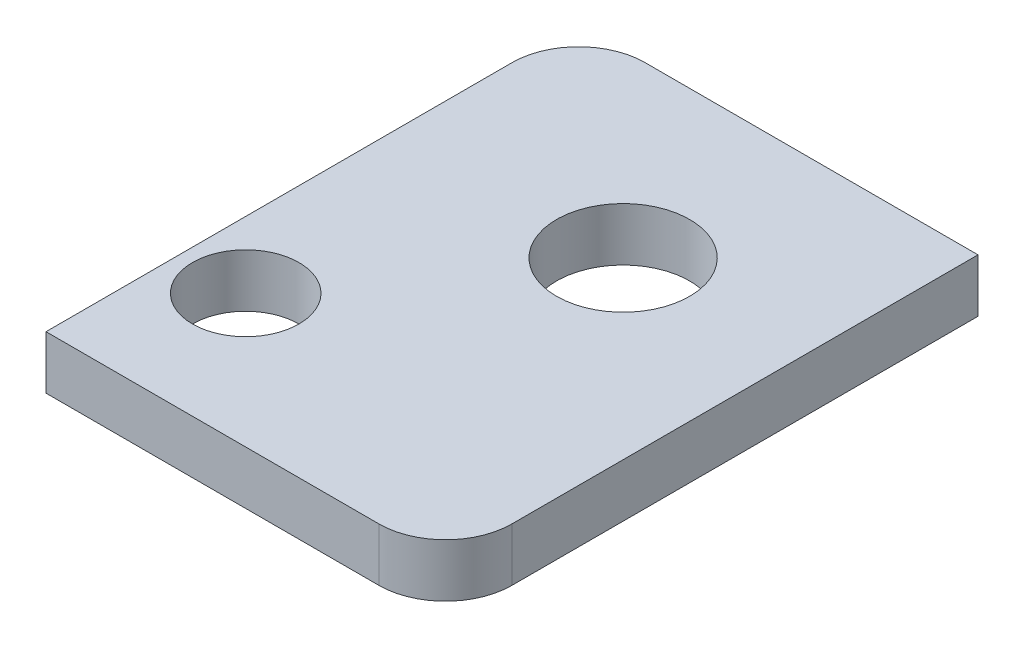
ISO-10303-21;
HEADER;
FILE_DESCRIPTION(('STEP AP214'),'2;1');
FILE_NAME('part.step','',(''),(''),'','','');
FILE_SCHEMA(('AUTOMOTIVE_DESIGN { 1 0 10303 214 1 1 1 1 }'));
ENDSEC;
DATA;
#1=APPLICATION_CONTEXT('core data for automotive mechanical design processes');
#2=APPLICATION_PROTOCOL_DEFINITION('international standard','automotive_design',2000,#1);
#3=PRODUCT_CONTEXT('',#1,'mechanical');
#4=PRODUCT('Part','Part','',(#3));
#5=PRODUCT_RELATED_PRODUCT_CATEGORY('part','',(#4));
#6=PRODUCT_DEFINITION_FORMATION('','',#4);
#7=PRODUCT_DEFINITION_CONTEXT('part definition',#1,'design');
#8=PRODUCT_DEFINITION('design','',#6,#7);
#9=PRODUCT_DEFINITION_SHAPE('','',#8);
#10=(LENGTH_UNIT() NAMED_UNIT(*) SI_UNIT(.MILLI.,.METRE.));
#11=(NAMED_UNIT(*) PLANE_ANGLE_UNIT() SI_UNIT($,.RADIAN.));
#12=(NAMED_UNIT(*) SI_UNIT($,.STERADIAN.) SOLID_ANGLE_UNIT());
#13=UNCERTAINTY_MEASURE_WITH_UNIT(LENGTH_MEASURE(1.E-05),#10,'distance_accuracy_value','');
#14=(GEOMETRIC_REPRESENTATION_CONTEXT(3) GLOBAL_UNCERTAINTY_ASSIGNED_CONTEXT((#13)) GLOBAL_UNIT_ASSIGNED_CONTEXT((#10,
#11,#12)) REPRESENTATION_CONTEXT('',''));
#15=CARTESIAN_POINT('',(0.,0.,0.));
#16=DIRECTION('',(0.,0.,1.));
#17=DIRECTION('',(1.,0.,0.));
#18=AXIS2_PLACEMENT_3D('',#15,#16,#17);
#19=CARTESIAN_POINT('',(5.,4.,-35.));
#20=DIRECTION('',(0.,-1.,0.));
#21=DIRECTION('',(0.,0.,-1.));
#22=AXIS2_PLACEMENT_3D('',#19,#20,#21);
#23=PLANE('',#22);
#24=DIRECTION('',(1.,0.,0.));
#25=VECTOR('',#24,1.);
#26=CARTESIAN_POINT('',(25.,4.,0.));
#27=LINE('',#26,#25);
#28=CARTESIAN_POINT('',(0.,4.,0.));
#29=VERTEX_POINT('',#28);
#30=CARTESIAN_POINT('',(25.,4.,0.));
#31=VERTEX_POINT('',#30);
#32=EDGE_CURVE('E131',#29,#31,#27,.T.);
#33=ORIENTED_EDGE('',*,*,#32,.T.);
#34=CARTESIAN_POINT('',(25.,4.,-5.));
#35=DIRECTION('',(0.,1.,0.));
#36=DIRECTION('',(0.,0.,1.));
#37=AXIS2_PLACEMENT_3D('',#34,#35,#36);
#38=CIRCLE('',#37,5.);
#39=CARTESIAN_POINT('',(30.,4.,-5.));
#40=VERTEX_POINT('',#39);
#41=EDGE_CURVE('E89',#31,#40,#38,.T.);
#42=ORIENTED_EDGE('',*,*,#41,.T.);
#43=DIRECTION('',(0.,0.,-1.));
#44=VECTOR('',#43,1.);
#45=CARTESIAN_POINT('',(30.,4.,-40.));
#46=LINE('',#45,#44);
#47=CARTESIAN_POINT('',(30.,4.,-40.));
#48=VERTEX_POINT('',#47);
#49=EDGE_CURVE('E102',#40,#48,#46,.T.);
#50=ORIENTED_EDGE('',*,*,#49,.T.);
#51=DIRECTION('',(-1.,0.,0.));
#52=VECTOR('',#51,1.);
#53=CARTESIAN_POINT('',(5.,4.,-40.));
#54=LINE('',#53,#52);
#55=CARTESIAN_POINT('',(5.,4.,-40.));
#56=VERTEX_POINT('',#55);
#57=EDGE_CURVE('E96',#48,#56,#54,.T.);
#58=ORIENTED_EDGE('',*,*,#57,.T.);
#59=CARTESIAN_POINT('',(5.,4.,-35.));
#60=DIRECTION('',(0.,1.,0.));
#61=DIRECTION('',(0.,0.,-1.));
#62=AXIS2_PLACEMENT_3D('',#59,#60,#61);
#63=CIRCLE('',#62,5.);
#64=CARTESIAN_POINT('',(0.,4.,-35.));
#65=VERTEX_POINT('',#64);
#66=EDGE_CURVE('E100',#56,#65,#63,.T.);
#67=ORIENTED_EDGE('',*,*,#66,.T.);
#68=DIRECTION('',(0.,0.,1.));
#69=VECTOR('',#68,1.);
#70=CARTESIAN_POINT('',(0.,4.,0.));
#71=LINE('',#70,#69);
#72=EDGE_CURVE('E52',#65,#29,#71,.T.);
#73=ORIENTED_EDGE('',*,*,#72,.T.);
#74=EDGE_LOOP('',(#33,#42,#50,#58,#67,#73));
#75=FACE_BOUND('',#74,.T.);
#76=CARTESIAN_POINT('',(5.,4.,-9.99999999999999));
#77=DIRECTION('',(0.,1.,0.));
#78=DIRECTION('',(0.,0.,1.));
#79=AXIS2_PLACEMENT_3D('',#76,#77,#78);
#80=CIRCLE('',#79,4.);
#81=CARTESIAN_POINT('',(5.,4.,-5.99999999999999));
#82=VERTEX_POINT('',#81);
#83=EDGE_CURVE('E124',#82,#82,#80,.T.);
#84=ORIENTED_EDGE('',*,*,#83,.F.);
#85=EDGE_LOOP('',(#84));
#86=FACE_BOUND('',#85,.T.);
#87=CARTESIAN_POINT('',(16.8726243869172,4.,-26.4739347577577));
#88=DIRECTION('',(0.,1.,0.));
#89=DIRECTION('',(0.,0.,1.));
#90=AXIS2_PLACEMENT_3D('',#87,#88,#89);
#91=CIRCLE('',#90,5.);
#92=CARTESIAN_POINT('',(16.8726243869172,4.,-21.4739347577576));
#93=VERTEX_POINT('',#92);
#94=EDGE_CURVE('E172',#93,#93,#91,.T.);
#95=ORIENTED_EDGE('',*,*,#94,.F.);
#96=EDGE_LOOP('',(#95));
#97=FACE_BOUND('',#96,.T.);
#98=ADVANCED_FACE('F35',(#75,#86,#97),#23,.F.);
#99=CARTESIAN_POINT('',(5.,0.,-35.));
#100=DIRECTION('',(0.,-1.,0.));
#101=DIRECTION('',(0.,0.,-1.));
#102=AXIS2_PLACEMENT_3D('',#99,#100,#101);
#103=PLANE('',#102);
#104=CARTESIAN_POINT('',(5.,0.,-9.99999999999999));
#105=DIRECTION('',(0.,1.,0.));
#106=DIRECTION('',(0.,0.,1.));
#107=AXIS2_PLACEMENT_3D('',#104,#105,#106);
#108=CIRCLE('',#107,4.);
#109=CARTESIAN_POINT('',(5.,0.,-5.99999999999999));
#110=VERTEX_POINT('',#109);
#111=EDGE_CURVE('E177',#110,#110,#108,.T.);
#112=ORIENTED_EDGE('',*,*,#111,.T.);
#113=EDGE_LOOP('',(#112));
#114=FACE_BOUND('',#113,.T.);
#115=DIRECTION('',(1.,0.,0.));
#116=VECTOR('',#115,1.);
#117=CARTESIAN_POINT('',(25.,0.,0.));
#118=LINE('',#117,#116);
#119=CARTESIAN_POINT('',(0.,0.,0.));
#120=VERTEX_POINT('',#119);
#121=CARTESIAN_POINT('',(25.,0.,0.));
#122=VERTEX_POINT('',#121);
#123=EDGE_CURVE('E120',#120,#122,#118,.T.);
#124=ORIENTED_EDGE('',*,*,#123,.F.);
#125=DIRECTION('',(0.,0.,1.));
#126=VECTOR('',#125,1.);
#127=CARTESIAN_POINT('',(0.,0.,0.));
#128=LINE('',#127,#126);
#129=CARTESIAN_POINT('',(0.,0.,-35.));
#130=VERTEX_POINT('',#129);
#131=EDGE_CURVE('E81',#130,#120,#128,.T.);
#132=ORIENTED_EDGE('',*,*,#131,.F.);
#133=CARTESIAN_POINT('',(5.,0.,-35.));
#134=DIRECTION('',(0.,1.,0.));
#135=DIRECTION('',(0.,0.,-1.));
#136=AXIS2_PLACEMENT_3D('',#133,#134,#135);
#137=CIRCLE('',#136,5.);
#138=CARTESIAN_POINT('',(5.,0.,-40.));
#139=VERTEX_POINT('',#138);
#140=EDGE_CURVE('E75',#139,#130,#137,.T.);
#141=ORIENTED_EDGE('',*,*,#140,.F.);
#142=DIRECTION('',(-1.,0.,0.));
#143=VECTOR('',#142,1.);
#144=CARTESIAN_POINT('',(5.,0.,-40.));
#145=LINE('',#144,#143);
#146=CARTESIAN_POINT('',(30.,0.,-40.));
#147=VERTEX_POINT('',#146);
#148=EDGE_CURVE('E110',#147,#139,#145,.T.);
#149=ORIENTED_EDGE('',*,*,#148,.F.);
#150=DIRECTION('',(0.,0.,-1.));
#151=VECTOR('',#150,1.);
#152=CARTESIAN_POINT('',(30.,0.,-40.));
#153=LINE('',#152,#151);
#154=CARTESIAN_POINT('',(30.,0.,-5.));
#155=VERTEX_POINT('',#154);
#156=EDGE_CURVE('E126',#155,#147,#153,.T.);
#157=ORIENTED_EDGE('',*,*,#156,.F.);
#158=CARTESIAN_POINT('',(25.,0.,-5.));
#159=DIRECTION('',(0.,1.,0.));
#160=DIRECTION('',(0.,0.,1.));
#161=AXIS2_PLACEMENT_3D('',#158,#159,#160);
#162=CIRCLE('',#161,5.);
#163=EDGE_CURVE('E123',#122,#155,#162,.T.);
#164=ORIENTED_EDGE('',*,*,#163,.F.);
#165=EDGE_LOOP('',(#124,#132,#141,#149,#157,#164));
#166=FACE_BOUND('',#165,.T.);
#167=CARTESIAN_POINT('',(16.8726243869172,0.,-26.4739347577577));
#168=DIRECTION('',(0.,1.,0.));
#169=DIRECTION('',(0.,0.,1.));
#170=AXIS2_PLACEMENT_3D('',#167,#168,#169);
#171=CIRCLE('',#170,5.);
#172=CARTESIAN_POINT('',(16.8726243869172,0.,-21.4739347577576));
#173=VERTEX_POINT('',#172);
#174=EDGE_CURVE('E175',#173,#173,#171,.T.);
#175=ORIENTED_EDGE('',*,*,#174,.T.);
#176=EDGE_LOOP('',(#175));
#177=FACE_BOUND('',#176,.T.);
#178=ADVANCED_FACE('F140',(#114,#166,#177),#103,.T.);
#179=CARTESIAN_POINT('',(25.,4.,0.));
#180=DIRECTION('',(0.,0.,-1.));
#181=DIRECTION('',(-1.,0.,0.));
#182=AXIS2_PLACEMENT_3D('',#179,#180,#181);
#183=PLANE('',#182);
#184=ORIENTED_EDGE('',*,*,#123,.T.);
#185=DIRECTION('',(0.,-1.,0.));
#186=VECTOR('',#185,1.);
#187=CARTESIAN_POINT('',(25.,4.,0.));
#188=LINE('',#187,#186);
#189=EDGE_CURVE('E11',#31,#122,#188,.T.);
#190=ORIENTED_EDGE('',*,*,#189,.F.);
#191=ORIENTED_EDGE('',*,*,#32,.F.);
#192=DIRECTION('',(0.,-1.,0.));
#193=VECTOR('',#192,1.);
#194=CARTESIAN_POINT('',(0.,4.,0.));
#195=LINE('',#194,#193);
#196=EDGE_CURVE('E116',#29,#120,#195,.T.);
#197=ORIENTED_EDGE('',*,*,#196,.T.);
#198=EDGE_LOOP('',(#184,#190,#191,#197));
#199=FACE_BOUND('',#198,.T.);
#200=ADVANCED_FACE('F37',(#199),#183,.F.);
#201=CARTESIAN_POINT('',(25.,4.,-5.));
#202=DIRECTION('',(0.,-1.,0.));
#203=DIRECTION('',(0.,0.,-1.));
#204=AXIS2_PLACEMENT_3D('',#201,#202,#203);
#205=CYLINDRICAL_SURFACE('',#204,5.);
#206=ORIENTED_EDGE('',*,*,#163,.T.);
#207=DIRECTION('',(0.,-1.,0.));
#208=VECTOR('',#207,1.);
#209=CARTESIAN_POINT('',(30.,4.,-5.));
#210=LINE('',#209,#208);
#211=EDGE_CURVE('E44',#40,#155,#210,.T.);
#212=ORIENTED_EDGE('',*,*,#211,.F.);
#213=ORIENTED_EDGE('',*,*,#41,.F.);
#214=ORIENTED_EDGE('',*,*,#189,.T.);
#215=EDGE_LOOP('',(#206,#212,#213,#214));
#216=FACE_BOUND('',#215,.T.);
#217=ADVANCED_FACE('F224',(#216),#205,.T.);
#218=CARTESIAN_POINT('',(30.,4.,-40.));
#219=DIRECTION('',(-1.,0.,0.));
#220=DIRECTION('',(0.,0.,1.));
#221=AXIS2_PLACEMENT_3D('',#218,#219,#220);
#222=PLANE('',#221);
#223=ORIENTED_EDGE('',*,*,#156,.T.);
#224=DIRECTION('',(0.,-1.,0.));
#225=VECTOR('',#224,1.);
#226=CARTESIAN_POINT('',(30.,4.,-40.));
#227=LINE('',#226,#225);
#228=EDGE_CURVE('E111',#48,#147,#227,.T.);
#229=ORIENTED_EDGE('',*,*,#228,.F.);
#230=ORIENTED_EDGE('',*,*,#49,.F.);
#231=ORIENTED_EDGE('',*,*,#211,.T.);
#232=EDGE_LOOP('',(#223,#229,#230,#231));
#233=FACE_BOUND('',#232,.T.);
#234=ADVANCED_FACE('F137',(#233),#222,.F.);
#235=CARTESIAN_POINT('',(5.,4.,-40.));
#236=DIRECTION('',(0.,0.,1.));
#237=DIRECTION('',(1.,0.,0.));
#238=AXIS2_PLACEMENT_3D('',#235,#236,#237);
#239=PLANE('',#238);
#240=ORIENTED_EDGE('',*,*,#148,.T.);
#241=DIRECTION('',(0.,-1.,0.));
#242=VECTOR('',#241,1.);
#243=CARTESIAN_POINT('',(5.,4.,-40.));
#244=LINE('',#243,#242);
#245=EDGE_CURVE('E107',#56,#139,#244,.T.);
#246=ORIENTED_EDGE('',*,*,#245,.F.);
#247=ORIENTED_EDGE('',*,*,#57,.F.);
#248=ORIENTED_EDGE('',*,*,#228,.T.);
#249=EDGE_LOOP('',(#240,#246,#247,#248));
#250=FACE_BOUND('',#249,.T.);
#251=ADVANCED_FACE('F108',(#250),#239,.F.);
#252=CARTESIAN_POINT('',(5.,4.,-35.));
#253=DIRECTION('',(0.,-1.,0.));
#254=DIRECTION('',(0.,0.,-1.));
#255=AXIS2_PLACEMENT_3D('',#252,#253,#254);
#256=CYLINDRICAL_SURFACE('',#255,5.);
#257=ORIENTED_EDGE('',*,*,#140,.T.);
#258=DIRECTION('',(0.,-1.,0.));
#259=VECTOR('',#258,1.);
#260=CARTESIAN_POINT('',(0.,4.,-35.));
#261=LINE('',#260,#259);
#262=EDGE_CURVE('E112',#65,#130,#261,.T.);
#263=ORIENTED_EDGE('',*,*,#262,.F.);
#264=ORIENTED_EDGE('',*,*,#66,.F.);
#265=ORIENTED_EDGE('',*,*,#245,.T.);
#266=EDGE_LOOP('',(#257,#263,#264,#265));
#267=FACE_BOUND('',#266,.T.);
#268=ADVANCED_FACE('F114',(#267),#256,.T.);
#269=CARTESIAN_POINT('',(0.,4.,0.));
#270=DIRECTION('',(1.,0.,0.));
#271=DIRECTION('',(0.,0.,-1.));
#272=AXIS2_PLACEMENT_3D('',#269,#270,#271);
#273=PLANE('',#272);
#274=ORIENTED_EDGE('',*,*,#131,.T.);
#275=ORIENTED_EDGE('',*,*,#196,.F.);
#276=ORIENTED_EDGE('',*,*,#72,.F.);
#277=ORIENTED_EDGE('',*,*,#262,.T.);
#278=EDGE_LOOP('',(#274,#275,#276,#277));
#279=FACE_BOUND('',#278,.T.);
#280=ADVANCED_FACE('F145',(#279),#273,.F.);
#281=CARTESIAN_POINT('',(5.,4.,-9.99999999999999));
#282=DIRECTION('',(0.,-1.,0.));
#283=DIRECTION('',(0.,0.,-1.));
#284=AXIS2_PLACEMENT_3D('',#281,#282,#283);
#285=CYLINDRICAL_SURFACE('',#284,4.);
#286=ORIENTED_EDGE('',*,*,#83,.T.);
#287=EDGE_LOOP('',(#286));
#288=FACE_BOUND('',#287,.T.);
#289=ORIENTED_EDGE('',*,*,#111,.F.);
#290=EDGE_LOOP('',(#289));
#291=FACE_BOUND('',#290,.T.);
#292=ADVANCED_FACE('F147',(#288,#291),#285,.F.);
#293=CARTESIAN_POINT('',(16.8726243869172,4.,-26.4739347577577));
#294=DIRECTION('',(0.,-1.,0.));
#295=DIRECTION('',(0.,0.,-1.));
#296=AXIS2_PLACEMENT_3D('',#293,#294,#295);
#297=CYLINDRICAL_SURFACE('',#296,5.);
#298=ORIENTED_EDGE('',*,*,#94,.T.);
#299=EDGE_LOOP('',(#298));
#300=FACE_BOUND('',#299,.T.);
#301=ORIENTED_EDGE('',*,*,#174,.F.);
#302=EDGE_LOOP('',(#301));
#303=FACE_BOUND('',#302,.T.);
#304=ADVANCED_FACE('F153',(#300,#303),#297,.F.);
#305=CLOSED_SHELL('',(#98,#178,#200,#217,#234,#251,#268,#280,#292,#304));
#306=MANIFOLD_SOLID_BREP('B2',#305);
#307=ADVANCED_BREP_SHAPE_REPRESENTATION('',(#18,#306),#14);
#308=SHAPE_DEFINITION_REPRESENTATION(#9,#307);
ENDSEC;
END-ISO-10303-21;
